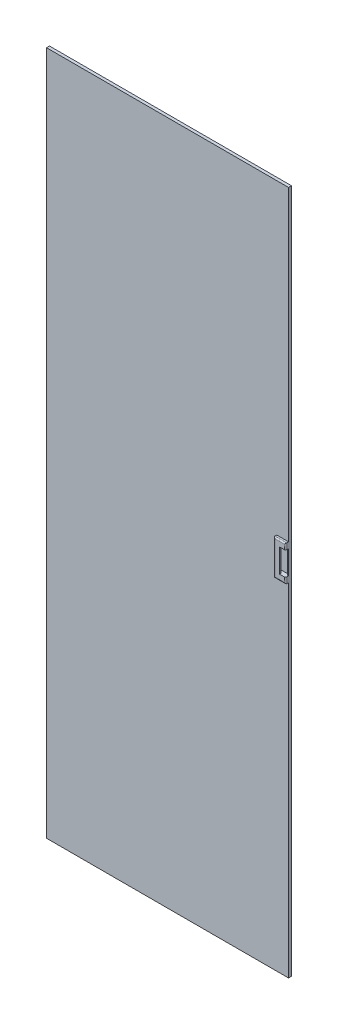
ISO-10303-21;
HEADER;
FILE_DESCRIPTION(('STEP AP214'),'2;1');
FILE_NAME('part.step','',(''),(''),'','','');
FILE_SCHEMA(('AUTOMOTIVE_DESIGN { 1 0 10303 214 1 1 1 1 }'));
ENDSEC;
DATA;
#1=APPLICATION_CONTEXT('core data for automotive mechanical design processes');
#2=APPLICATION_PROTOCOL_DEFINITION('international standard','automotive_design',2000,#1);
#3=PRODUCT_CONTEXT('',#1,'mechanical');
#4=PRODUCT('Part','Part','',(#3));
#5=PRODUCT_RELATED_PRODUCT_CATEGORY('part','',(#4));
#6=PRODUCT_DEFINITION_FORMATION('','',#4);
#7=PRODUCT_DEFINITION_CONTEXT('part definition',#1,'design');
#8=PRODUCT_DEFINITION('design','',#6,#7);
#9=PRODUCT_DEFINITION_SHAPE('','',#8);
#10=(LENGTH_UNIT() NAMED_UNIT(*) SI_UNIT(.MILLI.,.METRE.));
#11=(NAMED_UNIT(*) PLANE_ANGLE_UNIT() SI_UNIT($,.RADIAN.));
#12=(NAMED_UNIT(*) SI_UNIT($,.STERADIAN.) SOLID_ANGLE_UNIT());
#13=UNCERTAINTY_MEASURE_WITH_UNIT(LENGTH_MEASURE(1.E-05),#10,'distance_accuracy_value','');
#14=(GEOMETRIC_REPRESENTATION_CONTEXT(3) GLOBAL_UNCERTAINTY_ASSIGNED_CONTEXT((#13)) GLOBAL_UNIT_ASSIGNED_CONTEXT((#10,
#11,#12)) REPRESENTATION_CONTEXT('',''));
#15=CARTESIAN_POINT('',(0.,0.,0.));
#16=DIRECTION('',(0.,0.,1.));
#17=DIRECTION('',(1.,0.,0.));
#18=AXIS2_PLACEMENT_3D('',#15,#16,#17);
#19=CARTESIAN_POINT('',(0.,0.,6.35));
#20=DIRECTION('',(0.,0.,1.));
#21=DIRECTION('',(1.,0.,0.));
#22=AXIS2_PLACEMENT_3D('',#19,#20,#21);
#23=PLANE('',#22);
#24=DIRECTION('',(-1.,0.,0.));
#25=VECTOR('',#24,1.);
#26=CARTESIAN_POINT('',(0.,63.4381283682058,6.35));
#27=LINE('',#26,#25);
#28=CARTESIAN_POINT('',(260.35,63.4381283682058,6.35));
#29=VERTEX_POINT('',#28);
#30=CARTESIAN_POINT('',(257.726354600112,63.4381283682058,6.35));
#31=VERTEX_POINT('',#30);
#32=EDGE_CURVE('E220',#29,#31,#27,.T.);
#33=ORIENTED_EDGE('',*,*,#32,.T.);
#34=DIRECTION('',(0.,-1.,0.));
#35=VECTOR('',#34,1.);
#36=CARTESIAN_POINT('',(257.726354600112,0.,6.35));
#37=LINE('',#36,#35);
#38=CARTESIAN_POINT('',(257.726354600112,12.6204592635737,6.35));
#39=VERTEX_POINT('',#38);
#40=EDGE_CURVE('E211',#31,#39,#37,.T.);
#41=ORIENTED_EDGE('',*,*,#40,.T.);
#42=DIRECTION('',(-1.,0.,0.));
#43=VECTOR('',#42,1.);
#44=CARTESIAN_POINT('',(0.,12.6204592635737,6.35));
#45=LINE('',#44,#43);
#46=CARTESIAN_POINT('',(260.35,12.6204592635737,6.35));
#47=VERTEX_POINT('',#46);
#48=EDGE_CURVE('E226',#47,#39,#45,.T.);
#49=ORIENTED_EDGE('',*,*,#48,.F.);
#50=DIRECTION('',(0.,1.,0.));
#51=VECTOR('',#50,1.);
#52=CARTESIAN_POINT('',(260.35,736.6,6.35));
#53=LINE('',#52,#51);
#54=EDGE_CURVE('E266',#47,#29,#53,.T.);
#55=ORIENTED_EDGE('',*,*,#54,.T.);
#56=EDGE_LOOP('',(#33,#41,#49,#55));
#57=FACE_BOUND('',#56,.T.);
#58=ADVANCED_FACE('F38',(#57),#23,.T.);
#59=CARTESIAN_POINT('',(260.35,-736.6,6.35));
#60=VERTEX_POINT('',#59);
#61=CARTESIAN_POINT('',(260.35,-1.1167519098773E-13,6.35));
#62=VERTEX_POINT('',#61);
#63=EDGE_CURVE('E262',#60,#62,#53,.T.);
#64=ORIENTED_EDGE('',*,*,#63,.T.);
#65=DIRECTION('',(-1.,0.,0.));
#66=VECTOR('',#65,1.);
#67=CARTESIAN_POINT('',(0.,-1.24406517229417E-13,6.35));
#68=LINE('',#67,#66);
#69=CARTESIAN_POINT('',(234.95,-1.12328079512945E-13,6.35));
#70=VERTEX_POINT('',#69);
#71=EDGE_CURVE('E239',#62,#70,#68,.T.);
#72=ORIENTED_EDGE('',*,*,#71,.T.);
#73=DIRECTION('',(0.,1.,0.));
#74=VECTOR('',#73,1.);
#75=CARTESIAN_POINT('',(234.95,0.,6.35));
#76=LINE('',#75,#74);
#77=CARTESIAN_POINT('',(234.95,76.1999999999999,6.35));
#78=VERTEX_POINT('',#77);
#79=EDGE_CURVE('E236',#70,#78,#76,.T.);
#80=ORIENTED_EDGE('',*,*,#79,.T.);
#81=DIRECTION('',(-1.,0.,0.));
#82=VECTOR('',#81,1.);
#83=CARTESIAN_POINT('',(-3.33066907387544E-13,76.1999999999989,6.35));
#84=LINE('',#83,#82);
#85=CARTESIAN_POINT('',(260.35,76.1999999999999,6.35));
#86=VERTEX_POINT('',#85);
#87=EDGE_CURVE('E233',#86,#78,#84,.T.);
#88=ORIENTED_EDGE('',*,*,#87,.F.);
#89=CARTESIAN_POINT('',(260.35,736.6,6.35));
#90=VERTEX_POINT('',#89);
#91=EDGE_CURVE('E267',#86,#90,#53,.T.);
#92=ORIENTED_EDGE('',*,*,#91,.T.);
#93=DIRECTION('',(-1.,0.,0.));
#94=VECTOR('',#93,1.);
#95=CARTESIAN_POINT('',(-260.35,736.6,6.35));
#96=LINE('',#95,#94);
#97=CARTESIAN_POINT('',(-260.35,736.6,6.35));
#98=VERTEX_POINT('',#97);
#99=EDGE_CURVE('E265',#90,#98,#96,.T.);
#100=ORIENTED_EDGE('',*,*,#99,.T.);
#101=DIRECTION('',(0.,-1.,0.));
#102=VECTOR('',#101,1.);
#103=CARTESIAN_POINT('',(-260.35,736.6,6.35));
#104=LINE('',#103,#102);
#105=CARTESIAN_POINT('',(-260.35,-736.6,6.35));
#106=VERTEX_POINT('',#105);
#107=EDGE_CURVE('E269',#98,#106,#104,.T.);
#108=ORIENTED_EDGE('',*,*,#107,.T.);
#109=DIRECTION('',(1.,0.,0.));
#110=VECTOR('',#109,1.);
#111=CARTESIAN_POINT('',(-260.35,-736.6,6.35));
#112=LINE('',#111,#110);
#113=EDGE_CURVE('E271',#106,#60,#112,.T.);
#114=ORIENTED_EDGE('',*,*,#113,.T.);
#115=EDGE_LOOP('',(#64,#72,#80,#88,#92,#100,#108,#114));
#116=FACE_BOUND('',#115,.T.);
#117=ADVANCED_FACE('F361',(#116),#23,.T.);
#118=CARTESIAN_POINT('',(260.35,736.6,6.35));
#119=DIRECTION('',(-1.,0.,0.));
#120=DIRECTION('',(0.,-1.,0.));
#121=AXIS2_PLACEMENT_3D('',#118,#119,#120);
#122=PLANE('',#121);
#123=DIRECTION('',(0.,0.,-1.));
#124=VECTOR('',#123,1.);
#125=CARTESIAN_POINT('',(260.35,76.1999999999999,12.7));
#126=LINE('',#125,#124);
#127=CARTESIAN_POINT('',(260.35,76.1999999999999,10.16));
#128=VERTEX_POINT('',#127);
#129=EDGE_CURVE('E254',#128,#86,#126,.T.);
#130=ORIENTED_EDGE('',*,*,#129,.F.);
#131=DIRECTION('',(0.,1.,0.));
#132=VECTOR('',#131,1.);
#133=CARTESIAN_POINT('',(260.35,63.4381283682058,10.16));
#134=LINE('',#133,#132);
#135=CARTESIAN_POINT('',(260.35,63.4381283682058,10.16));
#136=VERTEX_POINT('',#135);
#137=EDGE_CURVE('E315',#128,#136,#134,.F.);
#138=ORIENTED_EDGE('',*,*,#137,.T.);
#139=DIRECTION('',(0.,0.,-1.));
#140=VECTOR('',#139,1.);
#141=CARTESIAN_POINT('',(260.35,63.4381283682058,12.7));
#142=LINE('',#141,#140);
#143=EDGE_CURVE('E256',#136,#29,#142,.T.);
#144=ORIENTED_EDGE('',*,*,#143,.T.);
#145=ORIENTED_EDGE('',*,*,#54,.F.);
#146=DIRECTION('',(0.,0.,-1.));
#147=VECTOR('',#146,1.);
#148=CARTESIAN_POINT('',(260.35,12.6204592635737,12.7));
#149=LINE('',#148,#147);
#150=CARTESIAN_POINT('',(260.35,12.6204592635737,10.16));
#151=VERTEX_POINT('',#150);
#152=EDGE_CURVE('E246',#151,#47,#149,.T.);
#153=ORIENTED_EDGE('',*,*,#152,.F.);
#154=DIRECTION('',(0.,1.,0.));
#155=VECTOR('',#154,1.);
#156=CARTESIAN_POINT('',(260.35,-1.1167519098773E-13,10.16));
#157=LINE('',#156,#155);
#158=CARTESIAN_POINT('',(260.35,-1.1167519098773E-13,10.16));
#159=VERTEX_POINT('',#158);
#160=EDGE_CURVE('E313',#151,#159,#157,.F.);
#161=ORIENTED_EDGE('',*,*,#160,.T.);
#162=DIRECTION('',(0.,0.,-1.));
#163=VECTOR('',#162,1.);
#164=CARTESIAN_POINT('',(260.35,-1.1167519098773E-13,12.7));
#165=LINE('',#164,#163);
#166=EDGE_CURVE('E248',#159,#62,#165,.T.);
#167=ORIENTED_EDGE('',*,*,#166,.T.);
#168=ORIENTED_EDGE('',*,*,#63,.F.);
#169=DIRECTION('',(0.,0.,-1.));
#170=VECTOR('',#169,1.);
#171=CARTESIAN_POINT('',(260.35,-736.6,6.35));
#172=LINE('',#171,#170);
#173=CARTESIAN_POINT('',(260.35,-736.6,0.));
#174=VERTEX_POINT('',#173);
#175=EDGE_CURVE('E273',#60,#174,#172,.T.);
#176=ORIENTED_EDGE('',*,*,#175,.T.);
#177=DIRECTION('',(0.,1.,0.));
#178=VECTOR('',#177,1.);
#179=CARTESIAN_POINT('',(260.35,736.6,0.));
#180=LINE('',#179,#178);
#181=CARTESIAN_POINT('',(260.35,736.6,0.));
#182=VERTEX_POINT('',#181);
#183=EDGE_CURVE('E261',#174,#182,#180,.T.);
#184=ORIENTED_EDGE('',*,*,#183,.T.);
#185=DIRECTION('',(0.,0.,-1.));
#186=VECTOR('',#185,1.);
#187=CARTESIAN_POINT('',(260.35,736.6,6.35));
#188=LINE('',#187,#186);
#189=EDGE_CURVE('E290',#90,#182,#188,.T.);
#190=ORIENTED_EDGE('',*,*,#189,.F.);
#191=ORIENTED_EDGE('',*,*,#91,.F.);
#192=EDGE_LOOP('',(#130,#138,#144,#145,#153,#161,#167,#168,#176,#184,#190,#191));
#193=FACE_BOUND('',#192,.T.);
#194=ADVANCED_FACE('F353',(#193),#122,.F.);
#195=CARTESIAN_POINT('',(-260.35,736.6,6.35));
#196=DIRECTION('',(0.,-1.,0.));
#197=DIRECTION('',(0.,0.,-1.));
#198=AXIS2_PLACEMENT_3D('',#195,#196,#197);
#199=PLANE('',#198);
#200=DIRECTION('',(-1.,0.,0.));
#201=VECTOR('',#200,1.);
#202=CARTESIAN_POINT('',(-260.35,736.6,0.));
#203=LINE('',#202,#201);
#204=CARTESIAN_POINT('',(-260.35,736.6,0.));
#205=VERTEX_POINT('',#204);
#206=EDGE_CURVE('E276',#182,#205,#203,.T.);
#207=ORIENTED_EDGE('',*,*,#206,.T.);
#208=DIRECTION('',(0.,0.,-1.));
#209=VECTOR('',#208,1.);
#210=CARTESIAN_POINT('',(-260.35,736.6,6.35));
#211=LINE('',#210,#209);
#212=EDGE_CURVE('E287',#98,#205,#211,.T.);
#213=ORIENTED_EDGE('',*,*,#212,.F.);
#214=ORIENTED_EDGE('',*,*,#99,.F.);
#215=ORIENTED_EDGE('',*,*,#189,.T.);
#216=EDGE_LOOP('',(#207,#213,#214,#215));
#217=FACE_BOUND('',#216,.T.);
#218=ADVANCED_FACE('F365',(#217),#199,.F.);
#219=CARTESIAN_POINT('',(-260.35,736.6,6.35));
#220=DIRECTION('',(1.,0.,0.));
#221=DIRECTION('',(0.,1.,0.));
#222=AXIS2_PLACEMENT_3D('',#219,#220,#221);
#223=PLANE('',#222);
#224=DIRECTION('',(0.,-1.,0.));
#225=VECTOR('',#224,1.);
#226=CARTESIAN_POINT('',(-260.35,736.6,0.));
#227=LINE('',#226,#225);
#228=CARTESIAN_POINT('',(-260.35,-736.6,0.));
#229=VERTEX_POINT('',#228);
#230=EDGE_CURVE('E278',#205,#229,#227,.T.);
#231=ORIENTED_EDGE('',*,*,#230,.T.);
#232=DIRECTION('',(0.,0.,-1.));
#233=VECTOR('',#232,1.);
#234=CARTESIAN_POINT('',(-260.35,-736.6,6.35));
#235=LINE('',#234,#233);
#236=EDGE_CURVE('E284',#106,#229,#235,.T.);
#237=ORIENTED_EDGE('',*,*,#236,.F.);
#238=ORIENTED_EDGE('',*,*,#107,.F.);
#239=ORIENTED_EDGE('',*,*,#212,.T.);
#240=EDGE_LOOP('',(#231,#237,#238,#239));
#241=FACE_BOUND('',#240,.T.);
#242=ADVANCED_FACE('F375',(#241),#223,.F.);
#243=CARTESIAN_POINT('',(-260.35,-736.6,6.35));
#244=DIRECTION('',(0.,1.,0.));
#245=DIRECTION('',(0.,0.,1.));
#246=AXIS2_PLACEMENT_3D('',#243,#244,#245);
#247=PLANE('',#246);
#248=DIRECTION('',(1.,0.,0.));
#249=VECTOR('',#248,1.);
#250=CARTESIAN_POINT('',(-260.35,-736.6,0.));
#251=LINE('',#250,#249);
#252=EDGE_CURVE('E280',#229,#174,#251,.T.);
#253=ORIENTED_EDGE('',*,*,#252,.T.);
#254=ORIENTED_EDGE('',*,*,#175,.F.);
#255=ORIENTED_EDGE('',*,*,#113,.F.);
#256=ORIENTED_EDGE('',*,*,#236,.T.);
#257=EDGE_LOOP('',(#253,#254,#255,#256));
#258=FACE_BOUND('',#257,.T.);
#259=ADVANCED_FACE('F379',(#258),#247,.F.);
#260=CARTESIAN_POINT('',(0.,0.,0.));
#261=DIRECTION('',(0.,0.,1.));
#262=DIRECTION('',(1.,0.,0.));
#263=AXIS2_PLACEMENT_3D('',#260,#261,#262);
#264=PLANE('',#263);
#265=ORIENTED_EDGE('',*,*,#183,.F.);
#266=ORIENTED_EDGE('',*,*,#252,.F.);
#267=ORIENTED_EDGE('',*,*,#230,.F.);
#268=ORIENTED_EDGE('',*,*,#206,.F.);
#269=EDGE_LOOP('',(#265,#266,#267,#268));
#270=FACE_BOUND('',#269,.T.);
#271=ADVANCED_FACE('F372',(#270),#264,.F.);
#272=CARTESIAN_POINT('',(247.65,1.35261384914326E-13,12.7));
#273=DIRECTION('',(1.,0.,0.));
#274=DIRECTION('',(0.,1.,0.));
#275=AXIS2_PLACEMENT_3D('',#272,#273,#274);
#276=PLANE('',#275);
#277=DIRECTION('',(0.,0.,-1.));
#278=VECTOR('',#277,1.);
#279=CARTESIAN_POINT('',(247.65,12.6204592635737,12.7));
#280=LINE('',#279,#278);
#281=CARTESIAN_POINT('',(247.65,12.6204592635737,12.7));
#282=VERTEX_POINT('',#281);
#283=CARTESIAN_POINT('',(247.65,12.6204592635737,10.4775));
#284=VERTEX_POINT('',#283);
#285=EDGE_CURVE('E230',#282,#284,#280,.T.);
#286=ORIENTED_EDGE('',*,*,#285,.T.);
#287=DIRECTION('',(0.,-1.,0.));
#288=VECTOR('',#287,1.);
#289=CARTESIAN_POINT('',(247.65,63.4381283682058,10.4775));
#290=LINE('',#289,#288);
#291=CARTESIAN_POINT('',(247.65,63.4381283682058,10.4775));
#292=VERTEX_POINT('',#291);
#293=EDGE_CURVE('E296',#284,#292,#290,.F.);
#294=ORIENTED_EDGE('',*,*,#293,.T.);
#295=DIRECTION('',(0.,0.,-1.));
#296=VECTOR('',#295,1.);
#297=CARTESIAN_POINT('',(247.65,63.4381283682058,12.7));
#298=LINE('',#297,#296);
#299=CARTESIAN_POINT('',(247.65,63.4381283682058,12.7));
#300=VERTEX_POINT('',#299);
#301=EDGE_CURVE('E258',#300,#292,#298,.T.);
#302=ORIENTED_EDGE('',*,*,#301,.F.);
#303=DIRECTION('',(0.,-1.,0.));
#304=VECTOR('',#303,1.);
#305=CARTESIAN_POINT('',(247.65,1.35261384914326E-13,12.7));
#306=LINE('',#305,#304);
#307=EDGE_CURVE('E222',#300,#282,#306,.T.);
#308=ORIENTED_EDGE('',*,*,#307,.T.);
#309=EDGE_LOOP('',(#286,#294,#302,#308));
#310=FACE_BOUND('',#309,.T.);
#311=ADVANCED_FACE('F400',(#310),#276,.T.);
#312=CARTESIAN_POINT('',(0.,63.4381283682058,12.7));
#313=DIRECTION('',(0.,-1.,0.));
#314=DIRECTION('',(0.,0.,-1.));
#315=AXIS2_PLACEMENT_3D('',#312,#313,#314);
#316=PLANE('',#315);
#317=ORIENTED_EDGE('',*,*,#143,.F.);
#318=CARTESIAN_POINT('',(257.81,63.4381283682058,10.16));
#319=DIRECTION('',(0.,-1.,0.));
#320=DIRECTION('',(0.,0.,-1.));
#321=AXIS2_PLACEMENT_3D('',#318,#319,#320);
#322=CIRCLE('',#321,2.54);
#323=CARTESIAN_POINT('',(257.81,63.4381283682058,12.7));
#324=VERTEX_POINT('',#323);
#325=EDGE_CURVE('E317',#136,#324,#322,.T.);
#326=ORIENTED_EDGE('',*,*,#325,.T.);
#327=DIRECTION('',(-1.,0.,0.));
#328=VECTOR('',#327,1.);
#329=CARTESIAN_POINT('',(0.,63.4381283682058,12.7));
#330=LINE('',#329,#328);
#331=EDGE_CURVE('E225',#324,#300,#330,.T.);
#332=ORIENTED_EDGE('',*,*,#331,.T.);
#333=ORIENTED_EDGE('',*,*,#301,.T.);
#334=CARTESIAN_POINT('',(245.11,63.4381283682058,10.4775));
#335=DIRECTION('',(0.,-1.,0.));
#336=DIRECTION('',(0.,0.,-1.));
#337=AXIS2_PLACEMENT_3D('',#334,#335,#336);
#338=CIRCLE('',#337,2.54);
#339=CARTESIAN_POINT('',(245.11,63.4381283682058,7.9375));
#340=VERTEX_POINT('',#339);
#341=EDGE_CURVE('E300',#292,#340,#338,.F.);
#342=ORIENTED_EDGE('',*,*,#341,.T.);
#343=DIRECTION('',(1.,0.,0.));
#344=VECTOR('',#343,1.);
#345=CARTESIAN_POINT('',(241.3,63.4381283682058,7.9375));
#346=LINE('',#345,#344);
#347=CARTESIAN_POINT('',(241.3,63.4381283682058,7.9375));
#348=VERTEX_POINT('',#347);
#349=EDGE_CURVE('E193',#348,#340,#346,.T.);
#350=ORIENTED_EDGE('',*,*,#349,.F.);
#351=DIRECTION('',(0.,0.,1.));
#352=VECTOR('',#351,1.);
#353=CARTESIAN_POINT('',(241.3,63.4381283682058,3.175));
#354=LINE('',#353,#352);
#355=CARTESIAN_POINT('',(241.3,63.4381283682058,3.175));
#356=VERTEX_POINT('',#355);
#357=EDGE_CURVE('E189',#356,#348,#354,.T.);
#358=ORIENTED_EDGE('',*,*,#357,.F.);
#359=DIRECTION('',(-1.,0.,0.));
#360=VECTOR('',#359,1.);
#361=CARTESIAN_POINT('',(0.,63.4381283682058,3.175));
#362=LINE('',#361,#360);
#363=CARTESIAN_POINT('',(257.726354600112,63.4381283682058,3.175));
#364=VERTEX_POINT('',#363);
#365=EDGE_CURVE('E177',#364,#356,#362,.T.);
#366=ORIENTED_EDGE('',*,*,#365,.F.);
#367=DIRECTION('',(0.,0.,1.));
#368=VECTOR('',#367,1.);
#369=CARTESIAN_POINT('',(257.726354600112,63.4381283682058,3.175));
#370=LINE('',#369,#368);
#371=EDGE_CURVE('E215',#364,#31,#370,.T.);
#372=ORIENTED_EDGE('',*,*,#371,.T.);
#373=ORIENTED_EDGE('',*,*,#32,.F.);
#374=EDGE_LOOP('',(#317,#326,#332,#333,#342,#350,#358,#366,#372,#373));
#375=FACE_BOUND('',#374,.T.);
#376=ADVANCED_FACE('F191',(#375),#316,.T.);
#377=CARTESIAN_POINT('',(-3.33066907387544E-13,76.1999999999989,12.7));
#378=DIRECTION('',(0.,-1.,0.));
#379=DIRECTION('',(1.,0.,0.));
#380=AXIS2_PLACEMENT_3D('',#377,#378,#379);
#381=PLANE('',#380);
#382=DIRECTION('',(0.,0.,-1.));
#383=VECTOR('',#382,1.);
#384=CARTESIAN_POINT('',(234.95,76.1999999999999,12.7));
#385=LINE('',#384,#383);
#386=CARTESIAN_POINT('',(234.95,76.1999999999999,10.16));
#387=VERTEX_POINT('',#386);
#388=EDGE_CURVE('E252',#387,#78,#385,.T.);
#389=ORIENTED_EDGE('',*,*,#388,.F.);
#390=DIRECTION('',(-1.,0.,0.));
#391=VECTOR('',#390,1.);
#392=CARTESIAN_POINT('',(260.35,76.2,10.16));
#393=LINE('',#392,#391);
#394=EDGE_CURVE('E47',#387,#128,#393,.F.);
#395=ORIENTED_EDGE('',*,*,#394,.T.);
#396=ORIENTED_EDGE('',*,*,#129,.T.);
#397=ORIENTED_EDGE('',*,*,#87,.T.);
#398=EDGE_LOOP('',(#389,#395,#396,#397));
#399=FACE_BOUND('',#398,.T.);
#400=ADVANCED_FACE('F385',(#399),#381,.F.);
#401=CARTESIAN_POINT('',(234.95,0.,12.7));
#402=DIRECTION('',(-1.,0.,0.));
#403=DIRECTION('',(0.,0.,1.));
#404=AXIS2_PLACEMENT_3D('',#401,#402,#403);
#405=PLANE('',#404);
#406=DIRECTION('',(0.,0.,-1.));
#407=VECTOR('',#406,1.);
#408=CARTESIAN_POINT('',(234.95,-1.12328079512945E-13,12.7));
#409=LINE('',#408,#407);
#410=CARTESIAN_POINT('',(234.95,-1.12328079512945E-13,10.16));
#411=VERTEX_POINT('',#410);
#412=EDGE_CURVE('E250',#411,#70,#409,.T.);
#413=ORIENTED_EDGE('',*,*,#412,.F.);
#414=DIRECTION('',(0.,1.,0.));
#415=VECTOR('',#414,1.);
#416=CARTESIAN_POINT('',(234.95,0.,10.16));
#417=LINE('',#416,#415);
#418=EDGE_CURVE('E11',#411,#387,#417,.T.);
#419=ORIENTED_EDGE('',*,*,#418,.T.);
#420=ORIENTED_EDGE('',*,*,#388,.T.);
#421=ORIENTED_EDGE('',*,*,#79,.F.);
#422=EDGE_LOOP('',(#413,#419,#420,#421));
#423=FACE_BOUND('',#422,.T.);
#424=ADVANCED_FACE('F383',(#423),#405,.T.);
#425=CARTESIAN_POINT('',(0.,-1.24406517229417E-13,12.7));
#426=DIRECTION('',(0.,-1.,0.));
#427=DIRECTION('',(1.,0.,0.));
#428=AXIS2_PLACEMENT_3D('',#425,#426,#427);
#429=PLANE('',#428);
#430=ORIENTED_EDGE('',*,*,#166,.F.);
#431=DIRECTION('',(-1.,0.,0.));
#432=VECTOR('',#431,1.);
#433=CARTESIAN_POINT('',(0.,-1.24406517229417E-13,10.16));
#434=LINE('',#433,#432);
#435=EDGE_CURVE('E61',#159,#411,#434,.T.);
#436=ORIENTED_EDGE('',*,*,#435,.T.);
#437=ORIENTED_EDGE('',*,*,#412,.T.);
#438=ORIENTED_EDGE('',*,*,#71,.F.);
#439=EDGE_LOOP('',(#430,#436,#437,#438));
#440=FACE_BOUND('',#439,.T.);
#441=ADVANCED_FACE('F381',(#440),#429,.T.);
#442=CARTESIAN_POINT('',(0.,12.6204592635737,12.7));
#443=DIRECTION('',(0.,-1.,0.));
#444=DIRECTION('',(0.,0.,-1.));
#445=AXIS2_PLACEMENT_3D('',#442,#443,#444);
#446=PLANE('',#445);
#447=DIRECTION('',(-1.,0.,0.));
#448=VECTOR('',#447,1.);
#449=CARTESIAN_POINT('',(0.,12.6204592635737,12.7));
#450=LINE('',#449,#448);
#451=CARTESIAN_POINT('',(257.81,12.6204592635737,12.7));
#452=VERTEX_POINT('',#451);
#453=EDGE_CURVE('E228',#452,#282,#450,.T.);
#454=ORIENTED_EDGE('',*,*,#453,.F.);
#455=CARTESIAN_POINT('',(257.81,12.6204592635737,10.16));
#456=DIRECTION('',(0.,-1.,0.));
#457=DIRECTION('',(0.,0.,-1.));
#458=AXIS2_PLACEMENT_3D('',#455,#456,#457);
#459=CIRCLE('',#458,2.54);
#460=EDGE_CURVE('E319',#452,#151,#459,.F.);
#461=ORIENTED_EDGE('',*,*,#460,.T.);
#462=ORIENTED_EDGE('',*,*,#152,.T.);
#463=ORIENTED_EDGE('',*,*,#48,.T.);
#464=DIRECTION('',(0.,0.,1.));
#465=VECTOR('',#464,1.);
#466=CARTESIAN_POINT('',(257.726354600112,12.6204592635737,3.175));
#467=LINE('',#466,#465);
#468=CARTESIAN_POINT('',(257.726354600112,12.6204592635737,3.175));
#469=VERTEX_POINT('',#468);
#470=EDGE_CURVE('E218',#469,#39,#467,.T.);
#471=ORIENTED_EDGE('',*,*,#470,.F.);
#472=DIRECTION('',(-1.,0.,0.));
#473=VECTOR('',#472,1.);
#474=CARTESIAN_POINT('',(0.,12.6204592635737,3.175));
#475=LINE('',#474,#473);
#476=CARTESIAN_POINT('',(241.3,12.6204592635737,3.175));
#477=VERTEX_POINT('',#476);
#478=EDGE_CURVE('E186',#469,#477,#475,.T.);
#479=ORIENTED_EDGE('',*,*,#478,.T.);
#480=DIRECTION('',(0.,0.,-1.));
#481=VECTOR('',#480,1.);
#482=CARTESIAN_POINT('',(241.3,12.6204592635737,3.175));
#483=LINE('',#482,#481);
#484=CARTESIAN_POINT('',(241.3,12.6204592635737,7.9375));
#485=VERTEX_POINT('',#484);
#486=EDGE_CURVE('E201',#485,#477,#483,.T.);
#487=ORIENTED_EDGE('',*,*,#486,.F.);
#488=DIRECTION('',(1.,0.,0.));
#489=VECTOR('',#488,1.);
#490=CARTESIAN_POINT('',(241.3,12.6204592635737,7.9375));
#491=LINE('',#490,#489);
#492=CARTESIAN_POINT('',(245.11,12.6204592635737,7.9375));
#493=VERTEX_POINT('',#492);
#494=EDGE_CURVE('E208',#485,#493,#491,.T.);
#495=ORIENTED_EDGE('',*,*,#494,.T.);
#496=CARTESIAN_POINT('',(245.11,12.6204592635737,10.4775));
#497=DIRECTION('',(0.,-1.,0.));
#498=DIRECTION('',(0.,0.,-1.));
#499=AXIS2_PLACEMENT_3D('',#496,#497,#498);
#500=CIRCLE('',#499,2.54);
#501=EDGE_CURVE('E298',#493,#284,#500,.T.);
#502=ORIENTED_EDGE('',*,*,#501,.T.);
#503=ORIENTED_EDGE('',*,*,#285,.F.);
#504=EDGE_LOOP('',(#454,#461,#462,#463,#471,#479,#487,#495,#502,#503));
#505=FACE_BOUND('',#504,.T.);
#506=ADVANCED_FACE('F347',(#505),#446,.F.);
#507=CARTESIAN_POINT('',(0.,0.,12.7));
#508=DIRECTION('',(0.,0.,1.));
#509=DIRECTION('',(1.,0.,0.));
#510=AXIS2_PLACEMENT_3D('',#507,#508,#509);
#511=PLANE('',#510);
#512=ORIENTED_EDGE('',*,*,#331,.F.);
#513=DIRECTION('',(0.,1.,0.));
#514=VECTOR('',#513,1.);
#515=CARTESIAN_POINT('',(257.81,76.1999999999999,12.7));
#516=LINE('',#515,#514);
#517=CARTESIAN_POINT('',(257.81,73.66,12.7));
#518=VERTEX_POINT('',#517);
#519=EDGE_CURVE('E310',#324,#518,#516,.T.);
#520=ORIENTED_EDGE('',*,*,#519,.T.);
#521=DIRECTION('',(-1.,0.,0.));
#522=VECTOR('',#521,1.);
#523=CARTESIAN_POINT('',(234.95,73.6599999999999,12.7));
#524=LINE('',#523,#522);
#525=CARTESIAN_POINT('',(237.49,73.6599999999999,12.7));
#526=VERTEX_POINT('',#525);
#527=EDGE_CURVE('E304',#518,#526,#524,.T.);
#528=ORIENTED_EDGE('',*,*,#527,.T.);
#529=DIRECTION('',(0.,1.,0.));
#530=VECTOR('',#529,1.);
#531=CARTESIAN_POINT('',(237.49,0.,12.7));
#532=LINE('',#531,#530);
#533=CARTESIAN_POINT('',(237.49,2.53999999999989,12.7));
#534=VERTEX_POINT('',#533);
#535=EDGE_CURVE('E302',#526,#534,#532,.F.);
#536=ORIENTED_EDGE('',*,*,#535,.T.);
#537=DIRECTION('',(-1.,0.,0.));
#538=VECTOR('',#537,1.);
#539=CARTESIAN_POINT('',(0.,2.53999999999988,12.7));
#540=LINE('',#539,#538);
#541=CARTESIAN_POINT('',(257.81,2.53999999999989,12.7));
#542=VERTEX_POINT('',#541);
#543=EDGE_CURVE('E306',#534,#542,#540,.F.);
#544=ORIENTED_EDGE('',*,*,#543,.T.);
#545=DIRECTION('',(0.,1.,0.));
#546=VECTOR('',#545,1.);
#547=CARTESIAN_POINT('',(257.81,12.6204592635737,12.7));
#548=LINE('',#547,#546);
#549=EDGE_CURVE('E308',#542,#452,#548,.T.);
#550=ORIENTED_EDGE('',*,*,#549,.T.);
#551=ORIENTED_EDGE('',*,*,#453,.T.);
#552=ORIENTED_EDGE('',*,*,#307,.F.);
#553=EDGE_LOOP('',(#512,#520,#528,#536,#544,#550,#551,#552));
#554=FACE_BOUND('',#553,.T.);
#555=ADVANCED_FACE('F340',(#554),#511,.T.);
#556=CARTESIAN_POINT('',(257.726354600112,0.,3.175));
#557=DIRECTION('',(-1.,0.,0.));
#558=DIRECTION('',(0.,0.,1.));
#559=AXIS2_PLACEMENT_3D('',#556,#557,#558);
#560=PLANE('',#559);
#561=ORIENTED_EDGE('',*,*,#40,.F.);
#562=ORIENTED_EDGE('',*,*,#371,.F.);
#563=DIRECTION('',(0.,-1.,0.));
#564=VECTOR('',#563,1.);
#565=CARTESIAN_POINT('',(257.726354600112,0.,3.175));
#566=LINE('',#565,#564);
#567=EDGE_CURVE('E184',#364,#469,#566,.T.);
#568=ORIENTED_EDGE('',*,*,#567,.T.);
#569=ORIENTED_EDGE('',*,*,#470,.T.);
#570=EDGE_LOOP('',(#561,#562,#568,#569));
#571=FACE_BOUND('',#570,.T.);
#572=ADVANCED_FACE('F410',(#571),#560,.T.);
#573=CARTESIAN_POINT('',(0.,0.,3.175));
#574=DIRECTION('',(0.,0.,1.));
#575=DIRECTION('',(1.,0.,0.));
#576=AXIS2_PLACEMENT_3D('',#573,#574,#575);
#577=PLANE('',#576);
#578=ORIENTED_EDGE('',*,*,#567,.F.);
#579=ORIENTED_EDGE('',*,*,#365,.T.);
#580=DIRECTION('',(0.,1.,0.));
#581=VECTOR('',#580,1.);
#582=CARTESIAN_POINT('',(241.3,63.4381283682058,3.175));
#583=LINE('',#582,#581);
#584=EDGE_CURVE('E181',#477,#356,#583,.T.);
#585=ORIENTED_EDGE('',*,*,#584,.F.);
#586=ORIENTED_EDGE('',*,*,#478,.F.);
#587=EDGE_LOOP('',(#578,#579,#585,#586));
#588=FACE_BOUND('',#587,.T.);
#589=ADVANCED_FACE('F179',(#588),#577,.T.);
#590=CARTESIAN_POINT('',(241.3,63.4381283682058,7.9375));
#591=DIRECTION('',(0.,0.,1.));
#592=DIRECTION('',(1.,0.,0.));
#593=AXIS2_PLACEMENT_3D('',#590,#591,#592);
#594=PLANE('',#593);
#595=ORIENTED_EDGE('',*,*,#349,.T.);
#596=DIRECTION('',(0.,-1.,0.));
#597=VECTOR('',#596,1.);
#598=CARTESIAN_POINT('',(245.11,12.6204592635737,7.9375));
#599=LINE('',#598,#597);
#600=EDGE_CURVE('E293',#340,#493,#599,.T.);
#601=ORIENTED_EDGE('',*,*,#600,.T.);
#602=ORIENTED_EDGE('',*,*,#494,.F.);
#603=DIRECTION('',(0.,-1.,0.));
#604=VECTOR('',#603,1.);
#605=CARTESIAN_POINT('',(241.3,63.4381283682058,7.9375));
#606=LINE('',#605,#604);
#607=EDGE_CURVE('E197',#348,#485,#606,.T.);
#608=ORIENTED_EDGE('',*,*,#607,.F.);
#609=EDGE_LOOP('',(#595,#601,#602,#608));
#610=FACE_BOUND('',#609,.T.);
#611=ADVANCED_FACE('F406',(#610),#594,.F.);
#612=CARTESIAN_POINT('',(241.3,1.31793144275497E-13,0.));
#613=DIRECTION('',(-1.,0.,0.));
#614=DIRECTION('',(0.,-1.,0.));
#615=AXIS2_PLACEMENT_3D('',#612,#613,#614);
#616=PLANE('',#615);
#617=ORIENTED_EDGE('',*,*,#584,.T.);
#618=ORIENTED_EDGE('',*,*,#357,.T.);
#619=ORIENTED_EDGE('',*,*,#607,.T.);
#620=ORIENTED_EDGE('',*,*,#486,.T.);
#621=EDGE_LOOP('',(#617,#618,#619,#620));
#622=FACE_BOUND('',#621,.T.);
#623=ADVANCED_FACE('F199',(#622),#616,.F.);
#624=CARTESIAN_POINT('',(245.11,63.4381283682058,10.4775));
#625=DIRECTION('',(0.,1.,0.));
#626=DIRECTION('',(-1.,0.,0.));
#627=AXIS2_PLACEMENT_3D('',#624,#625,#626);
#628=CYLINDRICAL_SURFACE('',#627,2.54);
#629=ORIENTED_EDGE('',*,*,#341,.F.);
#630=ORIENTED_EDGE('',*,*,#293,.F.);
#631=ORIENTED_EDGE('',*,*,#501,.F.);
#632=ORIENTED_EDGE('',*,*,#600,.F.);
#633=EDGE_LOOP('',(#629,#630,#631,#632));
#634=FACE_BOUND('',#633,.T.);
#635=ADVANCED_FACE('F403',(#634),#628,.T.);
#636=CARTESIAN_POINT('',(257.81,0.,10.16));
#637=DIRECTION('',(0.,-1.,0.));
#638=DIRECTION('',(1.,0.,0.));
#639=AXIS2_PLACEMENT_3D('',#636,#637,#638);
#640=CYLINDRICAL_SURFACE('',#639,2.54);
#641=ORIENTED_EDGE('',*,*,#460,.F.);
#642=ORIENTED_EDGE('',*,*,#549,.F.);
#643=CARTESIAN_POINT('',(257.81,2.53999999999989,10.16));
#644=DIRECTION('',(-0.707106781186547,-0.707106781186548,0.));
#645=DIRECTION('',(-0.707106781186548,0.707106781186547,0.));
#646=AXIS2_PLACEMENT_3D('',#643,#644,#645);
#647=ELLIPSE('',#646,3.59210244842766,2.54);
#648=EDGE_CURVE('E42',#159,#542,#647,.T.);
#649=ORIENTED_EDGE('',*,*,#648,.F.);
#650=ORIENTED_EDGE('',*,*,#160,.F.);
#651=EDGE_LOOP('',(#641,#642,#649,#650));
#652=FACE_BOUND('',#651,.T.);
#653=ADVANCED_FACE('F40',(#652),#640,.T.);
#654=CARTESIAN_POINT('',(0.,2.53999999999988,10.16));
#655=DIRECTION('',(-1.,0.,0.));
#656=DIRECTION('',(0.,-1.,0.));
#657=AXIS2_PLACEMENT_3D('',#654,#655,#656);
#658=CYLINDRICAL_SURFACE('',#657,2.54);
#659=ORIENTED_EDGE('',*,*,#648,.T.);
#660=ORIENTED_EDGE('',*,*,#543,.F.);
#661=CARTESIAN_POINT('',(237.49,2.53999999999989,10.16));
#662=DIRECTION('',(-0.707106781186547,0.707106781186547,0.));
#663=DIRECTION('',(0.707106781186547,0.707106781186547,0.));
#664=AXIS2_PLACEMENT_3D('',#661,#662,#663);
#665=ELLIPSE('',#664,3.59210244842766,2.54);
#666=EDGE_CURVE('E204',#411,#534,#665,.T.);
#667=ORIENTED_EDGE('',*,*,#666,.F.);
#668=ORIENTED_EDGE('',*,*,#435,.F.);
#669=EDGE_LOOP('',(#659,#660,#667,#668));
#670=FACE_BOUND('',#669,.T.);
#671=ADVANCED_FACE('F335',(#670),#658,.T.);
#672=CARTESIAN_POINT('',(237.49,0.,10.16));
#673=DIRECTION('',(0.,1.,0.));
#674=DIRECTION('',(0.,0.,1.));
#675=AXIS2_PLACEMENT_3D('',#672,#673,#674);
#676=CYLINDRICAL_SURFACE('',#675,2.54);
#677=ORIENTED_EDGE('',*,*,#666,.T.);
#678=ORIENTED_EDGE('',*,*,#535,.F.);
#679=CARTESIAN_POINT('',(237.49,73.6599999999999,10.16));
#680=DIRECTION('',(0.707106781186546,0.707106781186549,0.));
#681=DIRECTION('',(-0.707106781186549,0.707106781186546,0.));
#682=AXIS2_PLACEMENT_3D('',#679,#680,#681);
#683=ELLIPSE('',#682,3.59210244842765,2.54);
#684=EDGE_CURVE('E325',#387,#526,#683,.T.);
#685=ORIENTED_EDGE('',*,*,#684,.F.);
#686=ORIENTED_EDGE('',*,*,#418,.F.);
#687=EDGE_LOOP('',(#677,#678,#685,#686));
#688=FACE_BOUND('',#687,.T.);
#689=ADVANCED_FACE('F331',(#688),#676,.T.);
#690=CARTESIAN_POINT('',(-3.21964677141292E-13,73.6599999999989,10.16));
#691=DIRECTION('',(1.,0.,0.));
#692=DIRECTION('',(0.,1.,0.));
#693=AXIS2_PLACEMENT_3D('',#690,#691,#692);
#694=CYLINDRICAL_SURFACE('',#693,2.54);
#695=ORIENTED_EDGE('',*,*,#684,.T.);
#696=ORIENTED_EDGE('',*,*,#527,.F.);
#697=CARTESIAN_POINT('',(257.81,73.66,10.16));
#698=DIRECTION('',(0.707106781186549,-0.707106781186546,0.));
#699=DIRECTION('',(0.707106781186546,0.707106781186549,0.));
#700=AXIS2_PLACEMENT_3D('',#697,#698,#699);
#701=ELLIPSE('',#700,3.59210244842767,2.54);
#702=EDGE_CURVE('E323',#128,#518,#701,.T.);
#703=ORIENTED_EDGE('',*,*,#702,.F.);
#704=ORIENTED_EDGE('',*,*,#394,.F.);
#705=EDGE_LOOP('',(#695,#696,#703,#704));
#706=FACE_BOUND('',#705,.T.);
#707=ADVANCED_FACE('F395',(#706),#694,.T.);
#708=CARTESIAN_POINT('',(257.81,0.,10.16));
#709=DIRECTION('',(0.,-1.,0.));
#710=DIRECTION('',(1.,0.,0.));
#711=AXIS2_PLACEMENT_3D('',#708,#709,#710);
#712=CYLINDRICAL_SURFACE('',#711,2.54);
#713=ORIENTED_EDGE('',*,*,#325,.F.);
#714=ORIENTED_EDGE('',*,*,#137,.F.);
#715=ORIENTED_EDGE('',*,*,#702,.T.);
#716=ORIENTED_EDGE('',*,*,#519,.F.);
#717=EDGE_LOOP('',(#713,#714,#715,#716));
#718=FACE_BOUND('',#717,.T.);
#719=ADVANCED_FACE('F391',(#718),#712,.T.);
#720=CLOSED_SHELL('',(#58,#117,#194,#218,#242,#259,#271,#311,#376,#400,#424,#441,#506,#555,#572,
#589,#611,#623,#635,#653,#671,#689,#707,#719));
#721=MANIFOLD_SOLID_BREP('B2',#720);
#722=ADVANCED_BREP_SHAPE_REPRESENTATION('',(#18,#721),#14);
#723=SHAPE_DEFINITION_REPRESENTATION(#9,#722);
ENDSEC;
END-ISO-10303-21;
